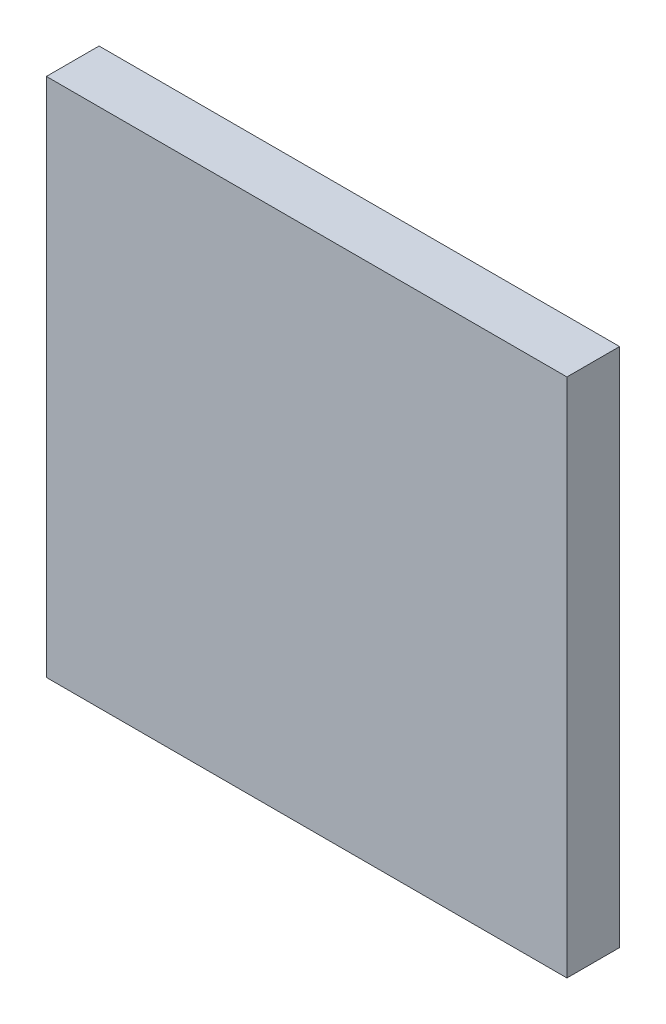
ISO-10303-21;
HEADER;
FILE_DESCRIPTION(('STEP AP214'),'2;1');
FILE_NAME('part.step','',(''),(''),'','','');
FILE_SCHEMA(('AUTOMOTIVE_DESIGN { 1 0 10303 214 1 1 1 1 }'));
ENDSEC;
DATA;
#1=APPLICATION_CONTEXT('core data for automotive mechanical design processes');
#2=APPLICATION_PROTOCOL_DEFINITION('international standard','automotive_design',2000,#1);
#3=PRODUCT_CONTEXT('',#1,'mechanical');
#4=PRODUCT('Part','Part','',(#3));
#5=PRODUCT_RELATED_PRODUCT_CATEGORY('part','',(#4));
#6=PRODUCT_DEFINITION_FORMATION('','',#4);
#7=PRODUCT_DEFINITION_CONTEXT('part definition',#1,'design');
#8=PRODUCT_DEFINITION('design','',#6,#7);
#9=PRODUCT_DEFINITION_SHAPE('','',#8);
#10=(LENGTH_UNIT() NAMED_UNIT(*) SI_UNIT(.MILLI.,.METRE.));
#11=(NAMED_UNIT(*) PLANE_ANGLE_UNIT() SI_UNIT($,.RADIAN.));
#12=(NAMED_UNIT(*) SI_UNIT($,.STERADIAN.) SOLID_ANGLE_UNIT());
#13=UNCERTAINTY_MEASURE_WITH_UNIT(LENGTH_MEASURE(1.E-05),#10,'distance_accuracy_value','');
#14=(GEOMETRIC_REPRESENTATION_CONTEXT(3) GLOBAL_UNCERTAINTY_ASSIGNED_CONTEXT((#13)) GLOBAL_UNIT_ASSIGNED_CONTEXT((#10,
#11,#12)) REPRESENTATION_CONTEXT('',''));
#15=CARTESIAN_POINT('',(0.,0.,0.));
#16=DIRECTION('',(0.,0.,1.));
#17=DIRECTION('',(1.,0.,0.));
#18=AXIS2_PLACEMENT_3D('',#15,#16,#17);
#19=CARTESIAN_POINT('',(53.975,53.975,5.461));
#20=DIRECTION('',(-1.,0.,0.));
#21=DIRECTION('',(0.,-1.,0.));
#22=AXIS2_PLACEMENT_3D('',#19,#20,#21);
#23=PLANE('',#22);
#24=DIRECTION('',(0.,1.,0.));
#25=VECTOR('',#24,1.);
#26=CARTESIAN_POINT('',(53.975,53.975,-5.461));
#27=LINE('',#26,#25);
#28=CARTESIAN_POINT('',(53.975,-53.975,-5.461));
#29=VERTEX_POINT('',#28);
#30=CARTESIAN_POINT('',(53.975,53.975,-5.461));
#31=VERTEX_POINT('',#30);
#32=EDGE_CURVE('E96',#29,#31,#27,.T.);
#33=ORIENTED_EDGE('',*,*,#32,.T.);
#34=DIRECTION('',(0.,0.,-1.));
#35=VECTOR('',#34,1.);
#36=CARTESIAN_POINT('',(53.975,53.975,5.461));
#37=LINE('',#36,#35);
#38=CARTESIAN_POINT('',(53.975,53.975,5.461));
#39=VERTEX_POINT('',#38);
#40=EDGE_CURVE('E11',#39,#31,#37,.T.);
#41=ORIENTED_EDGE('',*,*,#40,.F.);
#42=DIRECTION('',(0.,1.,0.));
#43=VECTOR('',#42,1.);
#44=CARTESIAN_POINT('',(53.975,53.975,5.461));
#45=LINE('',#44,#43);
#46=CARTESIAN_POINT('',(53.975,-53.975,5.461));
#47=VERTEX_POINT('',#46);
#48=EDGE_CURVE('E84',#47,#39,#45,.T.);
#49=ORIENTED_EDGE('',*,*,#48,.F.);
#50=DIRECTION('',(0.,0.,-1.));
#51=VECTOR('',#50,1.);
#52=CARTESIAN_POINT('',(53.975,-53.975,5.461));
#53=LINE('',#52,#51);
#54=EDGE_CURVE('E92',#47,#29,#53,.T.);
#55=ORIENTED_EDGE('',*,*,#54,.T.);
#56=EDGE_LOOP('',(#33,#41,#49,#55));
#57=FACE_BOUND('',#56,.T.);
#58=ADVANCED_FACE('F33',(#57),#23,.F.);
#59=CARTESIAN_POINT('',(-53.975,53.975,5.461));
#60=DIRECTION('',(0.,-1.,0.));
#61=DIRECTION('',(0.,0.,-1.));
#62=AXIS2_PLACEMENT_3D('',#59,#60,#61);
#63=PLANE('',#62);
#64=DIRECTION('',(-1.,0.,0.));
#65=VECTOR('',#64,1.);
#66=CARTESIAN_POINT('',(-53.975,53.975,-5.461));
#67=LINE('',#66,#65);
#68=CARTESIAN_POINT('',(-53.975,53.975,-5.461));
#69=VERTEX_POINT('',#68);
#70=EDGE_CURVE('E88',#31,#69,#67,.T.);
#71=ORIENTED_EDGE('',*,*,#70,.T.);
#72=DIRECTION('',(0.,0.,-1.));
#73=VECTOR('',#72,1.);
#74=CARTESIAN_POINT('',(-53.975,53.975,5.461));
#75=LINE('',#74,#73);
#76=CARTESIAN_POINT('',(-53.975,53.975,5.461));
#77=VERTEX_POINT('',#76);
#78=EDGE_CURVE('E41',#77,#69,#75,.T.);
#79=ORIENTED_EDGE('',*,*,#78,.F.);
#80=DIRECTION('',(-1.,0.,0.));
#81=VECTOR('',#80,1.);
#82=CARTESIAN_POINT('',(-53.975,53.975,5.461));
#83=LINE('',#82,#81);
#84=EDGE_CURVE('E79',#39,#77,#83,.T.);
#85=ORIENTED_EDGE('',*,*,#84,.F.);
#86=ORIENTED_EDGE('',*,*,#40,.T.);
#87=EDGE_LOOP('',(#71,#79,#85,#86));
#88=FACE_BOUND('',#87,.T.);
#89=ADVANCED_FACE('F87',(#88),#63,.F.);
#90=CARTESIAN_POINT('',(-53.975,53.975,5.461));
#91=DIRECTION('',(1.,0.,0.));
#92=DIRECTION('',(0.,1.,0.));
#93=AXIS2_PLACEMENT_3D('',#90,#91,#92);
#94=PLANE('',#93);
#95=DIRECTION('',(0.,-1.,0.));
#96=VECTOR('',#95,1.);
#97=CARTESIAN_POINT('',(-53.975,53.975,-5.461));
#98=LINE('',#97,#96);
#99=CARTESIAN_POINT('',(-53.975,-53.975,-5.461));
#100=VERTEX_POINT('',#99);
#101=EDGE_CURVE('E66',#69,#100,#98,.T.);
#102=ORIENTED_EDGE('',*,*,#101,.T.);
#103=DIRECTION('',(0.,0.,-1.));
#104=VECTOR('',#103,1.);
#105=CARTESIAN_POINT('',(-53.975,-53.975,5.461));
#106=LINE('',#105,#104);
#107=CARTESIAN_POINT('',(-53.975,-53.975,5.461));
#108=VERTEX_POINT('',#107);
#109=EDGE_CURVE('E89',#108,#100,#106,.T.);
#110=ORIENTED_EDGE('',*,*,#109,.F.);
#111=DIRECTION('',(0.,-1.,0.));
#112=VECTOR('',#111,1.);
#113=CARTESIAN_POINT('',(-53.975,53.975,5.461));
#114=LINE('',#113,#112);
#115=EDGE_CURVE('E82',#77,#108,#114,.T.);
#116=ORIENTED_EDGE('',*,*,#115,.F.);
#117=ORIENTED_EDGE('',*,*,#78,.T.);
#118=EDGE_LOOP('',(#102,#110,#116,#117));
#119=FACE_BOUND('',#118,.T.);
#120=ADVANCED_FACE('F90',(#119),#94,.F.);
#121=CARTESIAN_POINT('',(-53.975,-53.975,5.461));
#122=DIRECTION('',(0.,1.,0.));
#123=DIRECTION('',(0.,0.,1.));
#124=AXIS2_PLACEMENT_3D('',#121,#122,#123);
#125=PLANE('',#124);
#126=DIRECTION('',(1.,0.,0.));
#127=VECTOR('',#126,1.);
#128=CARTESIAN_POINT('',(-53.975,-53.975,-5.461));
#129=LINE('',#128,#127);
#130=EDGE_CURVE('E72',#100,#29,#129,.T.);
#131=ORIENTED_EDGE('',*,*,#130,.T.);
#132=ORIENTED_EDGE('',*,*,#54,.F.);
#133=DIRECTION('',(1.,0.,0.));
#134=VECTOR('',#133,1.);
#135=CARTESIAN_POINT('',(-53.975,-53.975,5.461));
#136=LINE('',#135,#134);
#137=EDGE_CURVE('E49',#108,#47,#136,.T.);
#138=ORIENTED_EDGE('',*,*,#137,.F.);
#139=ORIENTED_EDGE('',*,*,#109,.T.);
#140=EDGE_LOOP('',(#131,#132,#138,#139));
#141=FACE_BOUND('',#140,.T.);
#142=ADVANCED_FACE('F103',(#141),#125,.F.);
#143=CARTESIAN_POINT('',(0.,0.,5.461));
#144=DIRECTION('',(0.,0.,1.));
#145=DIRECTION('',(1.,0.,0.));
#146=AXIS2_PLACEMENT_3D('',#143,#144,#145);
#147=PLANE('',#146);
#148=ORIENTED_EDGE('',*,*,#48,.T.);
#149=ORIENTED_EDGE('',*,*,#84,.T.);
#150=ORIENTED_EDGE('',*,*,#115,.T.);
#151=ORIENTED_EDGE('',*,*,#137,.T.);
#152=EDGE_LOOP('',(#148,#149,#150,#151));
#153=FACE_BOUND('',#152,.T.);
#154=ADVANCED_FACE('F80',(#153),#147,.T.);
#155=CARTESIAN_POINT('',(0.,0.,-5.461));
#156=DIRECTION('',(0.,0.,1.));
#157=DIRECTION('',(1.,0.,0.));
#158=AXIS2_PLACEMENT_3D('',#155,#156,#157);
#159=PLANE('',#158);
#160=ORIENTED_EDGE('',*,*,#32,.F.);
#161=ORIENTED_EDGE('',*,*,#130,.F.);
#162=ORIENTED_EDGE('',*,*,#101,.F.);
#163=ORIENTED_EDGE('',*,*,#70,.F.);
#164=EDGE_LOOP('',(#160,#161,#162,#163));
#165=FACE_BOUND('',#164,.T.);
#166=ADVANCED_FACE('F106',(#165),#159,.F.);
#167=CLOSED_SHELL('',(#58,#89,#120,#142,#154,#166));
#168=MANIFOLD_SOLID_BREP('B2',#167);
#169=ADVANCED_BREP_SHAPE_REPRESENTATION('',(#18,#168),#14);
#170=SHAPE_DEFINITION_REPRESENTATION(#9,#169);
ENDSEC;
END-ISO-10303-21;
